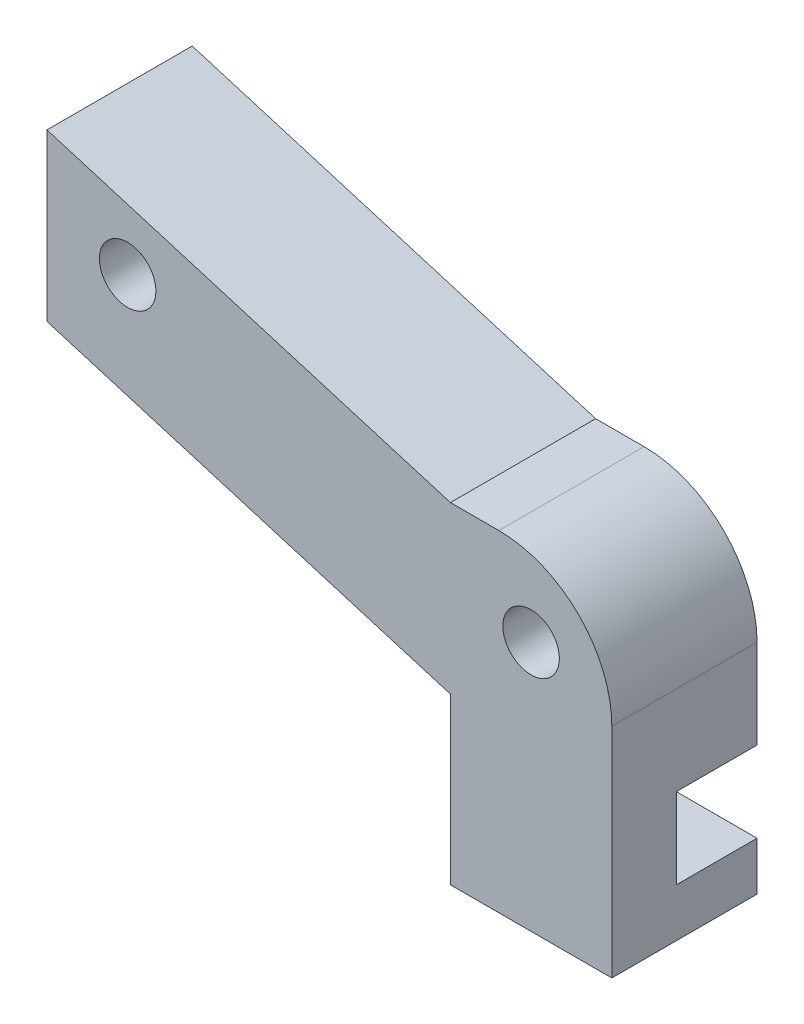
ISO-10303-21;
HEADER;
FILE_DESCRIPTION(('STEP AP214'),'2;1');
FILE_NAME('part.step','',(''),(''),'','','');
FILE_SCHEMA(('AUTOMOTIVE_DESIGN { 1 0 10303 214 1 1 1 1 }'));
ENDSEC;
DATA;
#1=APPLICATION_CONTEXT('core data for automotive mechanical design processes');
#2=APPLICATION_PROTOCOL_DEFINITION('international standard','automotive_design',2000,#1);
#3=PRODUCT_CONTEXT('',#1,'mechanical');
#4=PRODUCT('Part','Part','',(#3));
#5=PRODUCT_RELATED_PRODUCT_CATEGORY('part','',(#4));
#6=PRODUCT_DEFINITION_FORMATION('','',#4);
#7=PRODUCT_DEFINITION_CONTEXT('part definition',#1,'design');
#8=PRODUCT_DEFINITION('design','',#6,#7);
#9=PRODUCT_DEFINITION_SHAPE('','',#8);
#10=(LENGTH_UNIT() NAMED_UNIT(*) SI_UNIT(.MILLI.,.METRE.));
#11=(NAMED_UNIT(*) PLANE_ANGLE_UNIT() SI_UNIT($,.RADIAN.));
#12=(NAMED_UNIT(*) SI_UNIT($,.STERADIAN.) SOLID_ANGLE_UNIT());
#13=UNCERTAINTY_MEASURE_WITH_UNIT(LENGTH_MEASURE(1.E-05),#10,'distance_accuracy_value','');
#14=(GEOMETRIC_REPRESENTATION_CONTEXT(3) GLOBAL_UNCERTAINTY_ASSIGNED_CONTEXT((#13)) GLOBAL_UNIT_ASSIGNED_CONTEXT((#10,
#11,#12)) REPRESENTATION_CONTEXT('',''));
#15=CARTESIAN_POINT('',(0.,0.,0.));
#16=DIRECTION('',(0.,0.,1.));
#17=DIRECTION('',(1.,0.,0.));
#18=AXIS2_PLACEMENT_3D('',#15,#16,#17);
#19=CARTESIAN_POINT('',(0.,0.,0.));
#20=DIRECTION('',(0.,0.,1.));
#21=DIRECTION('',(1.,0.,0.));
#22=AXIS2_PLACEMENT_3D('',#19,#20,#21);
#23=PLANE('',#22);
#24=DIRECTION('',(0.,-1.,0.));
#25=VECTOR('',#24,1.);
#26=CARTESIAN_POINT('',(9.18420316956873,-114.974376778641,0.));
#27=LINE('',#26,#25);
#28=CARTESIAN_POINT('',(9.18420316956872,-122.206503807883,0.));
#29=VERTEX_POINT('',#28);
#30=CARTESIAN_POINT('',(9.18420316956873,-125.206503807883,0.));
#31=VERTEX_POINT('',#30);
#32=EDGE_CURVE('E239',#29,#31,#27,.T.);
#33=ORIENTED_EDGE('',*,*,#32,.F.);
#34=DIRECTION('',(1.,0.,0.));
#35=VECTOR('',#34,1.);
#36=CARTESIAN_POINT('',(9.18420316956872,-122.206503807883,0.));
#37=LINE('',#36,#35);
#38=CARTESIAN_POINT('',(19.1842031695687,-122.206503807883,0.));
#39=VERTEX_POINT('',#38);
#40=EDGE_CURVE('E171',#29,#39,#37,.T.);
#41=ORIENTED_EDGE('',*,*,#40,.T.);
#42=DIRECTION('',(0.,1.,0.));
#43=VECTOR('',#42,1.);
#44=CARTESIAN_POINT('',(19.1842031695687,-114.974376778641,0.));
#45=LINE('',#44,#43);
#46=CARTESIAN_POINT('',(19.1842031695687,-125.206503807883,0.));
#47=VERTEX_POINT('',#46);
#48=EDGE_CURVE('E247',#47,#39,#45,.T.);
#49=ORIENTED_EDGE('',*,*,#48,.F.);
#50=DIRECTION('',(1.,0.,0.));
#51=VECTOR('',#50,1.);
#52=CARTESIAN_POINT('',(19.1842031695687,-125.206503807883,0.));
#53=LINE('',#52,#51);
#54=EDGE_CURVE('E242',#31,#47,#53,.T.);
#55=ORIENTED_EDGE('',*,*,#54,.F.);
#56=EDGE_LOOP('',(#33,#41,#49,#55));
#57=FACE_BOUND('',#56,.T.);
#58=ADVANCED_FACE('F39',(#57),#23,.F.);
#59=CARTESIAN_POINT('',(14.1842031695687,-115.206503807883,3.));
#60=DIRECTION('',(0.,-1.,0.));
#61=DIRECTION('',(0.,0.,-1.));
#62=AXIS2_PLACEMENT_3D('',#59,#60,#61);
#63=CYLINDRICAL_SURFACE('',#62,1.5);
#64=CARTESIAN_POINT('',(14.1842031695687,-122.206503807883,3.));
#65=DIRECTION('',(0.,-1.,0.));
#66=DIRECTION('',(0.,0.,-1.));
#67=AXIS2_PLACEMENT_3D('',#64,#65,#66);
#68=CIRCLE('',#67,1.5);
#69=CARTESIAN_POINT('',(14.1842031695687,-122.206503807883,1.5));
#70=VERTEX_POINT('',#69);
#71=EDGE_CURVE('E189',#70,#70,#68,.F.);
#72=ORIENTED_EDGE('',*,*,#71,.T.);
#73=EDGE_LOOP('',(#72));
#74=FACE_BOUND('',#73,.T.);
#75=CARTESIAN_POINT('',(14.1842031695687,-125.206503807883,3.));
#76=DIRECTION('',(0.,-1.,0.));
#77=DIRECTION('',(0.,0.,-1.));
#78=AXIS2_PLACEMENT_3D('',#75,#76,#77);
#79=CIRCLE('',#78,1.5);
#80=CARTESIAN_POINT('',(14.1842031695687,-125.206503807883,1.5));
#81=VERTEX_POINT('',#80);
#82=EDGE_CURVE('E185',#81,#81,#79,.T.);
#83=ORIENTED_EDGE('',*,*,#82,.T.);
#84=EDGE_LOOP('',(#83));
#85=FACE_BOUND('',#84,.T.);
#86=ADVANCED_FACE('F332',(#74,#85),#63,.F.);
#87=CARTESIAN_POINT('',(-15.8157968304313,-97.1931579607244,9.));
#88=DIRECTION('',(-0.287347885566348,-0.957826285221151,0.));
#89=DIRECTION('',(0.957826285221151,-0.287347885566348,0.));
#90=AXIS2_PLACEMENT_3D('',#87,#88,#89);
#91=PLANE('',#90);
#92=DIRECTION('',(-0.957826285221151,0.287347885566348,0.));
#93=VECTOR('',#92,1.);
#94=CARTESIAN_POINT('',(-15.8157968304313,-97.1931579607244,0.));
#95=LINE('',#94,#93);
#96=CARTESIAN_POINT('',(9.18420316956873,-104.693157960725,0.));
#97=VERTEX_POINT('',#96);
#98=CARTESIAN_POINT('',(-15.8157968304313,-97.1931579607244,0.));
#99=VERTEX_POINT('',#98);
#100=EDGE_CURVE('E194',#97,#99,#95,.T.);
#101=ORIENTED_EDGE('',*,*,#100,.T.);
#102=DIRECTION('',(0.,0.,-1.));
#103=VECTOR('',#102,1.);
#104=CARTESIAN_POINT('',(-15.8157968304313,-97.1931579607244,9.));
#105=LINE('',#104,#103);
#106=CARTESIAN_POINT('',(-15.8157968304313,-97.1931579607244,9.));
#107=VERTEX_POINT('',#106);
#108=EDGE_CURVE('E271',#107,#99,#105,.T.);
#109=ORIENTED_EDGE('',*,*,#108,.F.);
#110=DIRECTION('',(-0.957826285221151,0.287347885566348,0.));
#111=VECTOR('',#110,1.);
#112=CARTESIAN_POINT('',(-15.8157968304313,-97.1931579607244,9.));
#113=LINE('',#112,#111);
#114=CARTESIAN_POINT('',(9.18420316956873,-104.693157960725,9.));
#115=VERTEX_POINT('',#114);
#116=EDGE_CURVE('E206',#115,#107,#113,.T.);
#117=ORIENTED_EDGE('',*,*,#116,.F.);
#118=DIRECTION('',(0.,0.,-1.));
#119=VECTOR('',#118,1.);
#120=CARTESIAN_POINT('',(9.18420316956873,-104.693157960725,9.));
#121=LINE('',#120,#119);
#122=EDGE_CURVE('E229',#115,#97,#121,.T.);
#123=ORIENTED_EDGE('',*,*,#122,.T.);
#124=EDGE_LOOP('',(#101,#109,#117,#123));
#125=FACE_BOUND('',#124,.T.);
#126=ADVANCED_FACE('F314',(#125),#91,.F.);
#127=CARTESIAN_POINT('',(-15.8157968304313,-97.1931579607244,9.));
#128=DIRECTION('',(1.,0.,0.));
#129=DIRECTION('',(0.,1.,0.));
#130=AXIS2_PLACEMENT_3D('',#127,#128,#129);
#131=PLANE('',#130);
#132=DIRECTION('',(0.,-1.,0.));
#133=VECTOR('',#132,1.);
#134=CARTESIAN_POINT('',(-15.8157968304313,-97.1931579607244,0.));
#135=LINE('',#134,#133);
#136=CARTESIAN_POINT('',(-15.8157968304313,-107.474376778641,0.));
#137=VERTEX_POINT('',#136);
#138=EDGE_CURVE('E233',#99,#137,#135,.T.);
#139=ORIENTED_EDGE('',*,*,#138,.T.);
#140=DIRECTION('',(0.,0.,-1.));
#141=VECTOR('',#140,1.);
#142=CARTESIAN_POINT('',(-15.8157968304313,-107.474376778641,9.));
#143=LINE('',#142,#141);
#144=CARTESIAN_POINT('',(-15.8157968304313,-107.474376778641,9.));
#145=VERTEX_POINT('',#144);
#146=EDGE_CURVE('E267',#145,#137,#143,.T.);
#147=ORIENTED_EDGE('',*,*,#146,.F.);
#148=DIRECTION('',(0.,-1.,0.));
#149=VECTOR('',#148,1.);
#150=CARTESIAN_POINT('',(-15.8157968304313,-97.1931579607244,9.));
#151=LINE('',#150,#149);
#152=EDGE_CURVE('E210',#107,#145,#151,.T.);
#153=ORIENTED_EDGE('',*,*,#152,.F.);
#154=ORIENTED_EDGE('',*,*,#108,.T.);
#155=EDGE_LOOP('',(#139,#147,#153,#154));
#156=FACE_BOUND('',#155,.T.);
#157=ADVANCED_FACE('F320',(#156),#131,.F.);
#158=CARTESIAN_POINT('',(-15.8157968304313,-107.474376778641,9.));
#159=DIRECTION('',(0.287347885566347,0.957826285221151,0.));
#160=DIRECTION('',(-0.957826285221151,0.287347885566347,0.));
#161=AXIS2_PLACEMENT_3D('',#158,#159,#160);
#162=PLANE('',#161);
#163=DIRECTION('',(0.957826285221151,-0.287347885566347,0.));
#164=VECTOR('',#163,1.);
#165=CARTESIAN_POINT('',(-15.8157968304313,-107.474376778641,0.));
#166=LINE('',#165,#164);
#167=CARTESIAN_POINT('',(9.18420316956873,-114.974376778641,0.));
#168=VERTEX_POINT('',#167);
#169=EDGE_CURVE('E236',#137,#168,#166,.T.);
#170=ORIENTED_EDGE('',*,*,#169,.T.);
#171=DIRECTION('',(0.,0.,-1.));
#172=VECTOR('',#171,1.);
#173=CARTESIAN_POINT('',(9.18420316956873,-114.974376778641,9.));
#174=LINE('',#173,#172);
#175=CARTESIAN_POINT('',(9.18420316956873,-114.974376778641,9.));
#176=VERTEX_POINT('',#175);
#177=EDGE_CURVE('E264',#176,#168,#174,.T.);
#178=ORIENTED_EDGE('',*,*,#177,.F.);
#179=DIRECTION('',(0.957826285221151,-0.287347885566347,0.));
#180=VECTOR('',#179,1.);
#181=CARTESIAN_POINT('',(-15.8157968304313,-107.474376778641,9.));
#182=LINE('',#181,#180);
#183=EDGE_CURVE('E214',#145,#176,#182,.T.);
#184=ORIENTED_EDGE('',*,*,#183,.F.);
#185=ORIENTED_EDGE('',*,*,#146,.T.);
#186=EDGE_LOOP('',(#170,#178,#184,#185));
#187=FACE_BOUND('',#186,.T.);
#188=ADVANCED_FACE('F322',(#187),#162,.F.);
#189=CARTESIAN_POINT('',(9.18420316956873,-114.974376778641,9.));
#190=DIRECTION('',(1.,0.,0.));
#191=DIRECTION('',(0.,0.,-1.));
#192=AXIS2_PLACEMENT_3D('',#189,#190,#191);
#193=PLANE('',#192);
#194=DIRECTION('',(0.,-1.,0.));
#195=VECTOR('',#194,1.);
#196=CARTESIAN_POINT('',(9.18420316956872,-122.206503807883,5.));
#197=LINE('',#196,#195);
#198=CARTESIAN_POINT('',(9.18420316956872,-117.206503807883,5.));
#199=VERTEX_POINT('',#198);
#200=CARTESIAN_POINT('',(9.18420316956872,-122.206503807883,5.));
#201=VERTEX_POINT('',#200);
#202=EDGE_CURVE('E145',#199,#201,#197,.T.);
#203=ORIENTED_EDGE('',*,*,#202,.T.);
#204=DIRECTION('',(0.,0.,-1.));
#205=VECTOR('',#204,1.);
#206=CARTESIAN_POINT('',(9.18420316956872,-122.206503807883,0.));
#207=LINE('',#206,#205);
#208=EDGE_CURVE('E151',#201,#29,#207,.T.);
#209=ORIENTED_EDGE('',*,*,#208,.T.);
#210=ORIENTED_EDGE('',*,*,#32,.T.);
#211=DIRECTION('',(0.,0.,-1.));
#212=VECTOR('',#211,1.);
#213=CARTESIAN_POINT('',(9.18420316956873,-125.206503807883,9.));
#214=LINE('',#213,#212);
#215=CARTESIAN_POINT('',(9.18420316956873,-125.206503807883,9.));
#216=VERTEX_POINT('',#215);
#217=EDGE_CURVE('E260',#216,#31,#214,.T.);
#218=ORIENTED_EDGE('',*,*,#217,.F.);
#219=DIRECTION('',(0.,-1.,0.));
#220=VECTOR('',#219,1.);
#221=CARTESIAN_POINT('',(9.18420316956873,-114.974376778641,9.));
#222=LINE('',#221,#220);
#223=EDGE_CURVE('E217',#176,#216,#222,.T.);
#224=ORIENTED_EDGE('',*,*,#223,.F.);
#225=ORIENTED_EDGE('',*,*,#177,.T.);
#226=CARTESIAN_POINT('',(9.18420316956873,-117.206503807883,0.));
#227=VERTEX_POINT('',#226);
#228=EDGE_CURVE('E157',#168,#227,#27,.T.);
#229=ORIENTED_EDGE('',*,*,#228,.T.);
#230=DIRECTION('',(0.,0.,1.));
#231=VECTOR('',#230,1.);
#232=CARTESIAN_POINT('',(9.18420316956872,-117.206503807883,0.));
#233=LINE('',#232,#231);
#234=EDGE_CURVE('E133',#227,#199,#233,.T.);
#235=ORIENTED_EDGE('',*,*,#234,.T.);
#236=EDGE_LOOP('',(#203,#209,#210,#218,#224,#225,#229,#235));
#237=FACE_BOUND('',#236,.T.);
#238=ADVANCED_FACE('F154',(#237),#193,.F.);
#239=CARTESIAN_POINT('',(19.1842031695687,-125.206503807883,9.));
#240=DIRECTION('',(0.,1.,0.));
#241=DIRECTION('',(0.,0.,1.));
#242=AXIS2_PLACEMENT_3D('',#239,#240,#241);
#243=PLANE('',#242);
#244=ORIENTED_EDGE('',*,*,#82,.F.);
#245=EDGE_LOOP('',(#244));
#246=FACE_BOUND('',#245,.T.);
#247=ORIENTED_EDGE('',*,*,#54,.T.);
#248=DIRECTION('',(0.,0.,-1.));
#249=VECTOR('',#248,1.);
#250=CARTESIAN_POINT('',(19.1842031695687,-125.206503807883,9.));
#251=LINE('',#250,#249);
#252=CARTESIAN_POINT('',(19.1842031695687,-125.206503807883,9.));
#253=VERTEX_POINT('',#252);
#254=EDGE_CURVE('E256',#253,#47,#251,.T.);
#255=ORIENTED_EDGE('',*,*,#254,.F.);
#256=DIRECTION('',(1.,0.,0.));
#257=VECTOR('',#256,1.);
#258=CARTESIAN_POINT('',(19.1842031695687,-125.206503807883,9.));
#259=LINE('',#258,#257);
#260=EDGE_CURVE('E220',#216,#253,#259,.T.);
#261=ORIENTED_EDGE('',*,*,#260,.F.);
#262=ORIENTED_EDGE('',*,*,#217,.T.);
#263=EDGE_LOOP('',(#247,#255,#261,#262));
#264=FACE_BOUND('',#263,.T.);
#265=ADVANCED_FACE('F296',(#246,#264),#243,.F.);
#266=CARTESIAN_POINT('',(19.1842031695687,-114.974376778641,9.));
#267=DIRECTION('',(-1.,0.,0.));
#268=DIRECTION('',(0.,0.,1.));
#269=AXIS2_PLACEMENT_3D('',#266,#267,#268);
#270=PLANE('',#269);
#271=CARTESIAN_POINT('',(19.1842031695687,-117.206503807883,0.));
#272=VERTEX_POINT('',#271);
#273=CARTESIAN_POINT('',(19.1842031695687,-111.693157960725,0.));
#274=VERTEX_POINT('',#273);
#275=EDGE_CURVE('E246',#272,#274,#45,.T.);
#276=ORIENTED_EDGE('',*,*,#275,.T.);
#277=DIRECTION('',(0.,0.,-1.));
#278=VECTOR('',#277,1.);
#279=CARTESIAN_POINT('',(19.1842031695687,-111.693157960725,9.));
#280=LINE('',#279,#278);
#281=CARTESIAN_POINT('',(19.1842031695687,-111.693157960725,9.));
#282=VERTEX_POINT('',#281);
#283=EDGE_CURVE('E48',#274,#282,#280,.F.);
#284=ORIENTED_EDGE('',*,*,#283,.T.);
#285=DIRECTION('',(0.,1.,0.));
#286=VECTOR('',#285,1.);
#287=CARTESIAN_POINT('',(19.1842031695687,-114.974376778641,9.));
#288=LINE('',#287,#286);
#289=EDGE_CURVE('E223',#253,#282,#288,.T.);
#290=ORIENTED_EDGE('',*,*,#289,.F.);
#291=ORIENTED_EDGE('',*,*,#254,.T.);
#292=ORIENTED_EDGE('',*,*,#48,.T.);
#293=DIRECTION('',(0.,0.,-1.));
#294=VECTOR('',#293,1.);
#295=CARTESIAN_POINT('',(19.1842031695687,-122.206503807883,0.));
#296=LINE('',#295,#294);
#297=CARTESIAN_POINT('',(19.1842031695687,-122.206503807883,5.));
#298=VERTEX_POINT('',#297);
#299=EDGE_CURVE('E159',#298,#39,#296,.T.);
#300=ORIENTED_EDGE('',*,*,#299,.F.);
#301=DIRECTION('',(0.,-1.,0.));
#302=VECTOR('',#301,1.);
#303=CARTESIAN_POINT('',(19.1842031695687,-122.206503807883,5.));
#304=LINE('',#303,#302);
#305=CARTESIAN_POINT('',(19.1842031695687,-117.206503807883,5.));
#306=VERTEX_POINT('',#305);
#307=EDGE_CURVE('E162',#306,#298,#304,.T.);
#308=ORIENTED_EDGE('',*,*,#307,.F.);
#309=DIRECTION('',(0.,0.,1.));
#310=VECTOR('',#309,1.);
#311=CARTESIAN_POINT('',(19.1842031695687,-117.206503807883,0.));
#312=LINE('',#311,#310);
#313=EDGE_CURVE('E136',#272,#306,#312,.T.);
#314=ORIENTED_EDGE('',*,*,#313,.F.);
#315=EDGE_LOOP('',(#276,#284,#290,#291,#292,#300,#308,#314));
#316=FACE_BOUND('',#315,.T.);
#317=ADVANCED_FACE('F299',(#316),#270,.F.);
#318=CARTESIAN_POINT('',(9.18420316956873,-104.693157960725,9.));
#319=DIRECTION('',(0.,-1.,0.));
#320=DIRECTION('',(0.,0.,-1.));
#321=AXIS2_PLACEMENT_3D('',#318,#319,#320);
#322=PLANE('',#321);
#323=DIRECTION('',(-1.,0.,0.));
#324=VECTOR('',#323,1.);
#325=CARTESIAN_POINT('',(9.18420316956873,-104.693157960725,9.));
#326=LINE('',#325,#324);
#327=CARTESIAN_POINT('',(12.1842031695687,-104.693157960725,9.));
#328=VERTEX_POINT('',#327);
#329=EDGE_CURVE('E226',#328,#115,#326,.T.);
#330=ORIENTED_EDGE('',*,*,#329,.F.);
#331=DIRECTION('',(0.,0.,-1.));
#332=VECTOR('',#331,1.);
#333=CARTESIAN_POINT('',(12.1842031695687,-104.693157960725,9.));
#334=LINE('',#333,#332);
#335=CARTESIAN_POINT('',(12.1842031695687,-104.693157960725,0.));
#336=VERTEX_POINT('',#335);
#337=EDGE_CURVE('E275',#328,#336,#334,.T.);
#338=ORIENTED_EDGE('',*,*,#337,.T.);
#339=DIRECTION('',(-1.,0.,0.));
#340=VECTOR('',#339,1.);
#341=CARTESIAN_POINT('',(9.18420316956873,-104.693157960725,0.));
#342=LINE('',#341,#340);
#343=EDGE_CURVE('E211',#336,#97,#342,.T.);
#344=ORIENTED_EDGE('',*,*,#343,.T.);
#345=ORIENTED_EDGE('',*,*,#122,.F.);
#346=EDGE_LOOP('',(#330,#338,#344,#345));
#347=FACE_BOUND('',#346,.T.);
#348=ADVANCED_FACE('F307',(#347),#322,.F.);
#349=CARTESIAN_POINT('',(0.,0.,9.));
#350=DIRECTION('',(0.,0.,1.));
#351=DIRECTION('',(1.,0.,0.));
#352=AXIS2_PLACEMENT_3D('',#349,#350,#351);
#353=PLANE('',#352);
#354=CARTESIAN_POINT('',(14.1842031695687,-109.693157960725,9.));
#355=DIRECTION('',(0.,0.,1.));
#356=DIRECTION('',(1.,0.,0.));
#357=AXIS2_PLACEMENT_3D('',#354,#355,#356);
#358=CIRCLE('',#357,1.75);
#359=CARTESIAN_POINT('',(15.9342031695687,-109.693157960725,9.));
#360=VERTEX_POINT('',#359);
#361=EDGE_CURVE('E195',#360,#360,#358,.T.);
#362=ORIENTED_EDGE('',*,*,#361,.F.);
#363=EDGE_LOOP('',(#362));
#364=FACE_BOUND('',#363,.T.);
#365=CARTESIAN_POINT('',(-10.8157968304313,-102.474376778641,9.));
#366=DIRECTION('',(0.,0.,1.));
#367=DIRECTION('',(1.,0.,0.));
#368=AXIS2_PLACEMENT_3D('',#365,#366,#367);
#369=CIRCLE('',#368,1.75);
#370=CARTESIAN_POINT('',(-9.06579683043127,-102.474376778641,9.));
#371=VERTEX_POINT('',#370);
#372=EDGE_CURVE('E184',#371,#371,#369,.T.);
#373=ORIENTED_EDGE('',*,*,#372,.F.);
#374=EDGE_LOOP('',(#373));
#375=FACE_BOUND('',#374,.T.);
#376=ORIENTED_EDGE('',*,*,#289,.T.);
#377=CARTESIAN_POINT('',(12.1842031695687,-111.693157960725,9.));
#378=DIRECTION('',(0.,0.,1.));
#379=DIRECTION('',(1.,0.,0.));
#380=AXIS2_PLACEMENT_3D('',#377,#378,#379);
#381=CIRCLE('',#380,7.);
#382=EDGE_CURVE('E11',#282,#328,#381,.T.);
#383=ORIENTED_EDGE('',*,*,#382,.T.);
#384=ORIENTED_EDGE('',*,*,#329,.T.);
#385=ORIENTED_EDGE('',*,*,#116,.T.);
#386=ORIENTED_EDGE('',*,*,#152,.T.);
#387=ORIENTED_EDGE('',*,*,#183,.T.);
#388=ORIENTED_EDGE('',*,*,#223,.T.);
#389=ORIENTED_EDGE('',*,*,#260,.T.);
#390=EDGE_LOOP('',(#376,#383,#384,#385,#386,#387,#388,#389));
#391=FACE_BOUND('',#390,.T.);
#392=ADVANCED_FACE('F302',(#364,#375,#391),#353,.T.);
#393=CARTESIAN_POINT('',(14.1842031695687,-109.693157960725,0.));
#394=DIRECTION('',(0.,0.,1.));
#395=DIRECTION('',(1.,0.,0.));
#396=AXIS2_PLACEMENT_3D('',#393,#394,#395);
#397=CIRCLE('',#396,1.75);
#398=CARTESIAN_POINT('',(15.9342031695687,-109.693157960725,0.));
#399=VERTEX_POINT('',#398);
#400=EDGE_CURVE('E190',#399,#399,#397,.T.);
#401=ORIENTED_EDGE('',*,*,#400,.T.);
#402=EDGE_LOOP('',(#401));
#403=FACE_BOUND('',#402,.T.);
#404=CARTESIAN_POINT('',(-10.8157968304313,-102.474376778641,0.));
#405=DIRECTION('',(0.,0.,1.));
#406=DIRECTION('',(1.,0.,0.));
#407=AXIS2_PLACEMENT_3D('',#404,#405,#406);
#408=CIRCLE('',#407,1.75);
#409=CARTESIAN_POINT('',(-9.06579683043127,-102.474376778641,0.));
#410=VERTEX_POINT('',#409);
#411=EDGE_CURVE('E199',#410,#410,#408,.T.);
#412=ORIENTED_EDGE('',*,*,#411,.T.);
#413=EDGE_LOOP('',(#412));
#414=FACE_BOUND('',#413,.T.);
#415=ORIENTED_EDGE('',*,*,#343,.F.);
#416=CARTESIAN_POINT('',(12.1842031695687,-111.693157960725,0.));
#417=DIRECTION('',(0.,0.,1.));
#418=DIRECTION('',(1.,0.,0.));
#419=AXIS2_PLACEMENT_3D('',#416,#417,#418);
#420=CIRCLE('',#419,7.);
#421=EDGE_CURVE('E62',#336,#274,#420,.F.);
#422=ORIENTED_EDGE('',*,*,#421,.T.);
#423=ORIENTED_EDGE('',*,*,#275,.F.);
#424=DIRECTION('',(1.,0.,0.));
#425=VECTOR('',#424,1.);
#426=CARTESIAN_POINT('',(9.18420316956872,-117.206503807883,0.));
#427=LINE('',#426,#425);
#428=EDGE_CURVE('E142',#227,#272,#427,.T.);
#429=ORIENTED_EDGE('',*,*,#428,.F.);
#430=ORIENTED_EDGE('',*,*,#228,.F.);
#431=ORIENTED_EDGE('',*,*,#169,.F.);
#432=ORIENTED_EDGE('',*,*,#138,.F.);
#433=ORIENTED_EDGE('',*,*,#100,.F.);
#434=EDGE_LOOP('',(#415,#422,#423,#429,#430,#431,#432,#433));
#435=FACE_BOUND('',#434,.T.);
#436=ADVANCED_FACE('F310',(#403,#414,#435),#23,.F.);
#437=CARTESIAN_POINT('',(-10.8157968304313,-102.474376778641,0.));
#438=DIRECTION('',(0.,0.,1.));
#439=DIRECTION('',(1.,0.,0.));
#440=AXIS2_PLACEMENT_3D('',#437,#438,#439);
#441=CYLINDRICAL_SURFACE('',#440,1.75);
#442=ORIENTED_EDGE('',*,*,#411,.F.);
#443=EDGE_LOOP('',(#442));
#444=FACE_BOUND('',#443,.T.);
#445=ORIENTED_EDGE('',*,*,#372,.T.);
#446=EDGE_LOOP('',(#445));
#447=FACE_BOUND('',#446,.T.);
#448=ADVANCED_FACE('F343',(#444,#447),#441,.F.);
#449=CARTESIAN_POINT('',(14.1842031695687,-109.693157960725,0.));
#450=DIRECTION('',(0.,0.,1.));
#451=DIRECTION('',(1.,0.,0.));
#452=AXIS2_PLACEMENT_3D('',#449,#450,#451);
#453=CYLINDRICAL_SURFACE('',#452,1.75);
#454=ORIENTED_EDGE('',*,*,#400,.F.);
#455=EDGE_LOOP('',(#454));
#456=FACE_BOUND('',#455,.T.);
#457=ORIENTED_EDGE('',*,*,#361,.T.);
#458=EDGE_LOOP('',(#457));
#459=FACE_BOUND('',#458,.T.);
#460=ADVANCED_FACE('F350',(#456,#459),#453,.F.);
#461=CARTESIAN_POINT('',(9.18420316956872,-122.206503807883,0.));
#462=DIRECTION('',(0.,-1.,0.));
#463=DIRECTION('',(0.,0.,-1.));
#464=AXIS2_PLACEMENT_3D('',#461,#462,#463);
#465=PLANE('',#464);
#466=ORIENTED_EDGE('',*,*,#299,.T.);
#467=ORIENTED_EDGE('',*,*,#40,.F.);
#468=ORIENTED_EDGE('',*,*,#208,.F.);
#469=DIRECTION('',(1.,0.,0.));
#470=VECTOR('',#469,1.);
#471=CARTESIAN_POINT('',(9.18420316956872,-122.206503807883,5.));
#472=LINE('',#471,#470);
#473=EDGE_CURVE('E141',#201,#298,#472,.T.);
#474=ORIENTED_EDGE('',*,*,#473,.T.);
#475=EDGE_LOOP('',(#466,#467,#468,#474));
#476=FACE_BOUND('',#475,.T.);
#477=ORIENTED_EDGE('',*,*,#71,.F.);
#478=EDGE_LOOP('',(#477));
#479=FACE_BOUND('',#478,.T.);
#480=ADVANCED_FACE('F363',(#476,#479),#465,.F.);
#481=CARTESIAN_POINT('',(9.18420316956872,-117.206503807883,0.));
#482=DIRECTION('',(0.,1.,0.));
#483=DIRECTION('',(0.,0.,1.));
#484=AXIS2_PLACEMENT_3D('',#481,#482,#483);
#485=PLANE('',#484);
#486=ORIENTED_EDGE('',*,*,#313,.T.);
#487=DIRECTION('',(1.,0.,0.));
#488=VECTOR('',#487,1.);
#489=CARTESIAN_POINT('',(9.18420316956872,-117.206503807883,5.));
#490=LINE('',#489,#488);
#491=EDGE_CURVE('E128',#199,#306,#490,.T.);
#492=ORIENTED_EDGE('',*,*,#491,.F.);
#493=ORIENTED_EDGE('',*,*,#234,.F.);
#494=ORIENTED_EDGE('',*,*,#428,.T.);
#495=EDGE_LOOP('',(#486,#492,#493,#494));
#496=FACE_BOUND('',#495,.T.);
#497=CARTESIAN_POINT('',(14.1842031695687,-117.206503807883,3.));
#498=DIRECTION('',(0.,1.,0.));
#499=DIRECTION('',(0.,0.,1.));
#500=AXIS2_PLACEMENT_3D('',#497,#498,#499);
#501=CIRCLE('',#500,1.5);
#502=CARTESIAN_POINT('',(14.1842031695687,-117.206503807883,4.5));
#503=VERTEX_POINT('',#502);
#504=EDGE_CURVE('E175',#503,#503,#501,.F.);
#505=ORIENTED_EDGE('',*,*,#504,.F.);
#506=EDGE_LOOP('',(#505));
#507=FACE_BOUND('',#506,.T.);
#508=ADVANCED_FACE('F130',(#496,#507),#485,.F.);
#509=CARTESIAN_POINT('',(9.18420316956872,-122.206503807883,5.));
#510=DIRECTION('',(0.,0.,1.));
#511=DIRECTION('',(1.,0.,0.));
#512=AXIS2_PLACEMENT_3D('',#509,#510,#511);
#513=PLANE('',#512);
#514=ORIENTED_EDGE('',*,*,#307,.T.);
#515=ORIENTED_EDGE('',*,*,#473,.F.);
#516=ORIENTED_EDGE('',*,*,#202,.F.);
#517=ORIENTED_EDGE('',*,*,#491,.T.);
#518=EDGE_LOOP('',(#514,#515,#516,#517));
#519=FACE_BOUND('',#518,.T.);
#520=ADVANCED_FACE('F146',(#519),#513,.F.);
#521=CARTESIAN_POINT('',(14.1842031695687,-115.206503807883,3.));
#522=DIRECTION('',(0.,-1.,0.));
#523=DIRECTION('',(0.,0.,-1.));
#524=AXIS2_PLACEMENT_3D('',#521,#522,#523);
#525=PLANE('',#524);
#526=CARTESIAN_POINT('',(14.1842031695687,-115.206503807883,3.));
#527=DIRECTION('',(0.,-1.,0.));
#528=DIRECTION('',(0.,0.,-1.));
#529=AXIS2_PLACEMENT_3D('',#526,#527,#528);
#530=CIRCLE('',#529,1.5);
#531=CARTESIAN_POINT('',(14.1842031695687,-115.206503807883,1.5));
#532=VERTEX_POINT('',#531);
#533=EDGE_CURVE('E180',#532,#532,#530,.T.);
#534=ORIENTED_EDGE('',*,*,#533,.T.);
#535=EDGE_LOOP('',(#534));
#536=FACE_BOUND('',#535,.T.);
#537=ADVANCED_FACE('F373',(#536),#525,.T.);
#538=ORIENTED_EDGE('',*,*,#504,.T.);
#539=EDGE_LOOP('',(#538));
#540=FACE_BOUND('',#539,.T.);
#541=ORIENTED_EDGE('',*,*,#533,.F.);
#542=EDGE_LOOP('',(#541));
#543=FACE_BOUND('',#542,.T.);
#544=ADVANCED_FACE('F339',(#540,#543),#63,.F.);
#545=CARTESIAN_POINT('',(12.1842031695687,-111.693157960725,9.));
#546=DIRECTION('',(0.,0.,-1.));
#547=DIRECTION('',(-1.,0.,0.));
#548=AXIS2_PLACEMENT_3D('',#545,#546,#547);
#549=CYLINDRICAL_SURFACE('',#548,7.);
#550=ORIENTED_EDGE('',*,*,#382,.F.);
#551=ORIENTED_EDGE('',*,*,#283,.F.);
#552=ORIENTED_EDGE('',*,*,#421,.F.);
#553=ORIENTED_EDGE('',*,*,#337,.F.);
#554=EDGE_LOOP('',(#550,#551,#552,#553));
#555=FACE_BOUND('',#554,.T.);
#556=ADVANCED_FACE('F41',(#555),#549,.T.);
#557=CLOSED_SHELL('',(#58,#86,#126,#157,#188,#238,#265,#317,#348,#392,#436,#448,#460,#480,#508,
#520,#537,#544,#556));
#558=MANIFOLD_SOLID_BREP('B2',#557);
#559=ADVANCED_BREP_SHAPE_REPRESENTATION('',(#18,#558),#14);
#560=SHAPE_DEFINITION_REPRESENTATION(#9,#559);
ENDSEC;
END-ISO-10303-21;
